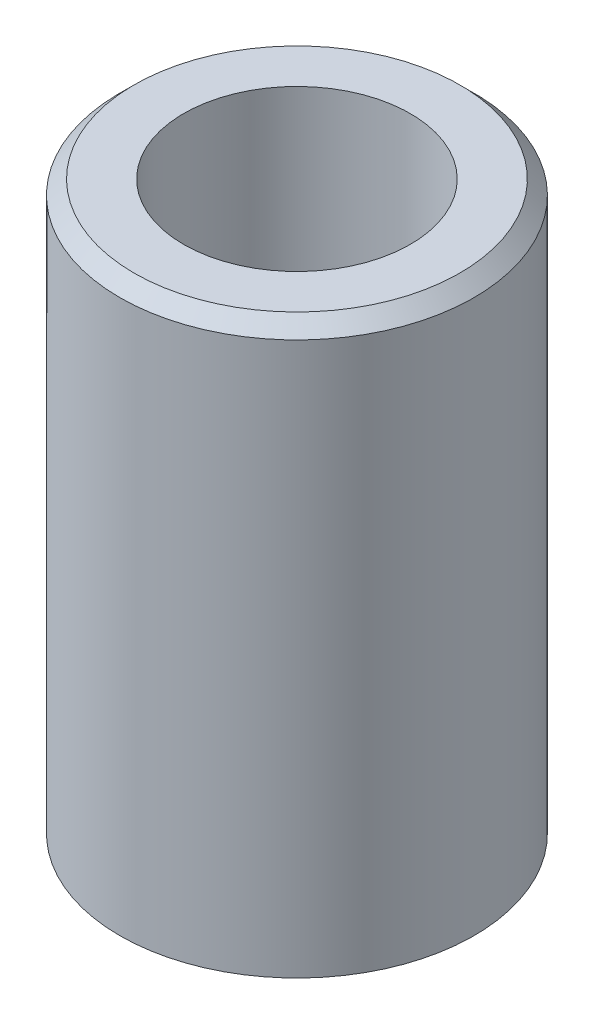
ISO-10303-21;
HEADER;
FILE_DESCRIPTION(('STEP AP214'),'2;1');
FILE_NAME('part.step','',(''),(''),'','','');
FILE_SCHEMA(('AUTOMOTIVE_DESIGN { 1 0 10303 214 1 1 1 1 }'));
ENDSEC;
DATA;
#1=APPLICATION_CONTEXT('core data for automotive mechanical design processes');
#2=APPLICATION_PROTOCOL_DEFINITION('international standard','automotive_design',2000,#1);
#3=PRODUCT_CONTEXT('',#1,'mechanical');
#4=PRODUCT('Part','Part','',(#3));
#5=PRODUCT_RELATED_PRODUCT_CATEGORY('part','',(#4));
#6=PRODUCT_DEFINITION_FORMATION('','',#4);
#7=PRODUCT_DEFINITION_CONTEXT('part definition',#1,'design');
#8=PRODUCT_DEFINITION('design','',#6,#7);
#9=PRODUCT_DEFINITION_SHAPE('','',#8);
#10=(LENGTH_UNIT() NAMED_UNIT(*) SI_UNIT(.MILLI.,.METRE.));
#11=(NAMED_UNIT(*) PLANE_ANGLE_UNIT() SI_UNIT($,.RADIAN.));
#12=(NAMED_UNIT(*) SI_UNIT($,.STERADIAN.) SOLID_ANGLE_UNIT());
#13=UNCERTAINTY_MEASURE_WITH_UNIT(LENGTH_MEASURE(1.E-05),#10,'distance_accuracy_value','');
#14=(GEOMETRIC_REPRESENTATION_CONTEXT(3) GLOBAL_UNCERTAINTY_ASSIGNED_CONTEXT((#13)) GLOBAL_UNIT_ASSIGNED_CONTEXT((#10,
#11,#12)) REPRESENTATION_CONTEXT('',''));
#15=CARTESIAN_POINT('',(0.,0.,0.));
#16=DIRECTION('',(0.,0.,1.));
#17=DIRECTION('',(1.,0.,0.));
#18=AXIS2_PLACEMENT_3D('',#15,#16,#17);
#19=CARTESIAN_POINT('',(0.,8.,0.));
#20=DIRECTION('',(0.,1.,0.));
#21=DIRECTION('',(0.,0.,1.));
#22=AXIS2_PLACEMENT_3D('',#19,#20,#21);
#23=PLANE('',#22);
#24=CARTESIAN_POINT('',(0.,8.,0.));
#25=DIRECTION('',(0.,1.,0.));
#26=DIRECTION('',(0.,0.,1.));
#27=AXIS2_PLACEMENT_3D('',#24,#25,#26);
#28=CIRCLE('',#27,2.3);
#29=CARTESIAN_POINT('',(0.,8.,2.3));
#30=VERTEX_POINT('',#29);
#31=EDGE_CURVE('E52',#30,#30,#28,.T.);
#32=ORIENTED_EDGE('',*,*,#31,.T.);
#33=EDGE_LOOP('',(#32));
#34=FACE_BOUND('',#33,.T.);
#35=CARTESIAN_POINT('',(0.,8.,0.));
#36=DIRECTION('',(0.,1.,0.));
#37=DIRECTION('',(0.,0.,1.));
#38=AXIS2_PLACEMENT_3D('',#35,#36,#37);
#39=CIRCLE('',#38,1.6);
#40=CARTESIAN_POINT('',(0.,8.,1.6));
#41=VERTEX_POINT('',#40);
#42=EDGE_CURVE('E62',#41,#41,#39,.T.);
#43=ORIENTED_EDGE('',*,*,#42,.F.);
#44=EDGE_LOOP('',(#43));
#45=FACE_BOUND('',#44,.T.);
#46=ADVANCED_FACE('F43',(#34,#45),#23,.T.);
#47=CARTESIAN_POINT('',(0.,0.,0.));
#48=DIRECTION('',(0.,1.,0.));
#49=DIRECTION('',(0.,0.,1.));
#50=AXIS2_PLACEMENT_3D('',#47,#48,#49);
#51=PLANE('',#50);
#52=CARTESIAN_POINT('',(0.,0.,0.));
#53=DIRECTION('',(0.,1.,0.));
#54=DIRECTION('',(0.,0.,1.));
#55=AXIS2_PLACEMENT_3D('',#52,#53,#54);
#56=CIRCLE('',#55,2.5);
#57=CARTESIAN_POINT('',(0.,0.,2.5));
#58=VERTEX_POINT('',#57);
#59=EDGE_CURVE('E57',#58,#58,#56,.T.);
#60=ORIENTED_EDGE('',*,*,#59,.F.);
#61=EDGE_LOOP('',(#60));
#62=FACE_BOUND('',#61,.T.);
#63=CARTESIAN_POINT('',(0.,0.,0.));
#64=DIRECTION('',(0.,1.,0.));
#65=DIRECTION('',(0.,0.,1.));
#66=AXIS2_PLACEMENT_3D('',#63,#64,#65);
#67=CIRCLE('',#66,1.6);
#68=CARTESIAN_POINT('',(0.,0.,1.6));
#69=VERTEX_POINT('',#68);
#70=EDGE_CURVE('E65',#69,#69,#67,.T.);
#71=ORIENTED_EDGE('',*,*,#70,.T.);
#72=EDGE_LOOP('',(#71));
#73=FACE_BOUND('',#72,.T.);
#74=ADVANCED_FACE('F77',(#62,#73),#51,.F.);
#75=CARTESIAN_POINT('',(0.,8.,0.));
#76=DIRECTION('',(0.,-1.,0.));
#77=DIRECTION('',(0.,0.,-1.));
#78=AXIS2_PLACEMENT_3D('',#75,#76,#77);
#79=CYLINDRICAL_SURFACE('',#78,2.5);
#80=CARTESIAN_POINT('',(0.,7.8,0.));
#81=DIRECTION('',(0.,1.,0.));
#82=DIRECTION('',(0.,0.,1.));
#83=AXIS2_PLACEMENT_3D('',#80,#81,#82);
#84=CIRCLE('',#83,2.5);
#85=CARTESIAN_POINT('',(0.,7.8,2.5));
#86=VERTEX_POINT('',#85);
#87=EDGE_CURVE('E10',#86,#86,#84,.F.);
#88=ORIENTED_EDGE('',*,*,#87,.T.);
#89=EDGE_LOOP('',(#88));
#90=FACE_BOUND('',#89,.T.);
#91=ORIENTED_EDGE('',*,*,#59,.T.);
#92=EDGE_LOOP('',(#91));
#93=FACE_BOUND('',#92,.T.);
#94=ADVANCED_FACE('F82',(#90,#93),#79,.T.);
#95=CARTESIAN_POINT('',(0.,8.,0.));
#96=DIRECTION('',(0.,-1.,0.));
#97=DIRECTION('',(0.,0.,-1.));
#98=AXIS2_PLACEMENT_3D('',#95,#96,#97);
#99=CYLINDRICAL_SURFACE('',#98,1.6);
#100=ORIENTED_EDGE('',*,*,#42,.T.);
#101=EDGE_LOOP('',(#100));
#102=FACE_BOUND('',#101,.T.);
#103=ORIENTED_EDGE('',*,*,#70,.F.);
#104=EDGE_LOOP('',(#103));
#105=FACE_BOUND('',#104,.T.);
#106=ADVANCED_FACE('F73',(#102,#105),#99,.F.);
#107=CARTESIAN_POINT('',(0.,8.,0.));
#108=DIRECTION('',(0.,-1.,0.));
#109=DIRECTION('',(0.,0.,-1.));
#110=AXIS2_PLACEMENT_3D('',#107,#108,#109);
#111=CONICAL_SURFACE('',#110,2.3,0.785398163397445);
#112=ORIENTED_EDGE('',*,*,#87,.F.);
#113=EDGE_LOOP('',(#112));
#114=FACE_BOUND('',#113,.T.);
#115=ORIENTED_EDGE('',*,*,#31,.F.);
#116=EDGE_LOOP('',(#115));
#117=FACE_BOUND('',#116,.T.);
#118=ADVANCED_FACE('F46',(#114,#117),#111,.T.);
#119=CLOSED_SHELL('',(#46,#74,#94,#106,#118));
#120=MANIFOLD_SOLID_BREP('B2',#119);
#121=ADVANCED_BREP_SHAPE_REPRESENTATION('',(#18,#120),#14);
#122=SHAPE_DEFINITION_REPRESENTATION(#9,#121);
ENDSEC;
END-ISO-10303-21;
